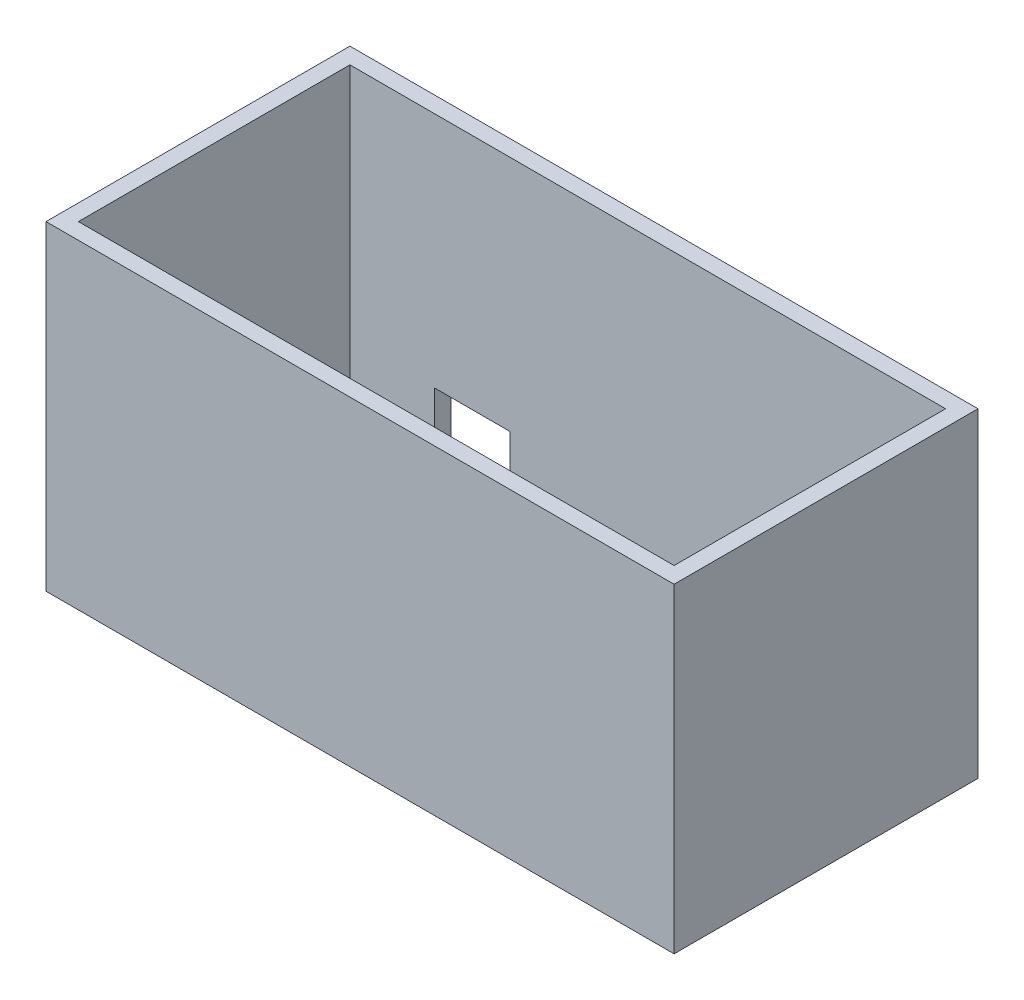
ISO-10303-21;
HEADER;
FILE_DESCRIPTION(('STEP AP214'),'2;1');
FILE_NAME('part.step','',(''),(''),'','','');
FILE_SCHEMA(('AUTOMOTIVE_DESIGN { 1 0 10303 214 1 1 1 1 }'));
ENDSEC;
DATA;
#1=APPLICATION_CONTEXT('core data for automotive mechanical design processes');
#2=APPLICATION_PROTOCOL_DEFINITION('international standard','automotive_design',2000,#1);
#3=PRODUCT_CONTEXT('',#1,'mechanical');
#4=PRODUCT('Part','Part','',(#3));
#5=PRODUCT_RELATED_PRODUCT_CATEGORY('part','',(#4));
#6=PRODUCT_DEFINITION_FORMATION('','',#4);
#7=PRODUCT_DEFINITION_CONTEXT('part definition',#1,'design');
#8=PRODUCT_DEFINITION('design','',#6,#7);
#9=PRODUCT_DEFINITION_SHAPE('','',#8);
#10=(LENGTH_UNIT() NAMED_UNIT(*) SI_UNIT(.MILLI.,.METRE.));
#11=(NAMED_UNIT(*) PLANE_ANGLE_UNIT() SI_UNIT($,.RADIAN.));
#12=(NAMED_UNIT(*) SI_UNIT($,.STERADIAN.) SOLID_ANGLE_UNIT());
#13=UNCERTAINTY_MEASURE_WITH_UNIT(LENGTH_MEASURE(1.E-05),#10,'distance_accuracy_value','');
#14=(GEOMETRIC_REPRESENTATION_CONTEXT(3) GLOBAL_UNCERTAINTY_ASSIGNED_CONTEXT((#13)) GLOBAL_UNIT_ASSIGNED_CONTEXT((#10,
#11,#12)) REPRESENTATION_CONTEXT('',''));
#15=CARTESIAN_POINT('',(0.,0.,0.));
#16=DIRECTION('',(0.,0.,1.));
#17=DIRECTION('',(1.,0.,0.));
#18=AXIS2_PLACEMENT_3D('',#15,#16,#17);
#19=CARTESIAN_POINT('',(98.425,5.08,47.625));
#20=DIRECTION('',(-1.,0.,0.));
#21=DIRECTION('',(0.,0.,1.));
#22=AXIS2_PLACEMENT_3D('',#19,#20,#21);
#23=PLANE('',#22);
#24=DIRECTION('',(0.,0.,-1.));
#25=VECTOR('',#24,1.);
#26=CARTESIAN_POINT('',(98.425,0.,47.625));
#27=LINE('',#26,#25);
#28=CARTESIAN_POINT('',(98.425,0.,47.625));
#29=VERTEX_POINT('',#28);
#30=CARTESIAN_POINT('',(98.425,0.,-47.625));
#31=VERTEX_POINT('',#30);
#32=EDGE_CURVE('E190',#29,#31,#27,.T.);
#33=ORIENTED_EDGE('',*,*,#32,.T.);
#34=DIRECTION('',(0.,-1.,0.));
#35=VECTOR('',#34,1.);
#36=CARTESIAN_POINT('',(98.425,5.08,-47.625));
#37=LINE('',#36,#35);
#38=CARTESIAN_POINT('',(98.425,100.33,-47.625));
#39=VERTEX_POINT('',#38);
#40=EDGE_CURVE('E208',#39,#31,#37,.T.);
#41=ORIENTED_EDGE('',*,*,#40,.F.);
#42=DIRECTION('',(0.,0.,-1.));
#43=VECTOR('',#42,1.);
#44=CARTESIAN_POINT('',(98.425,100.33,-47.625));
#45=LINE('',#44,#43);
#46=CARTESIAN_POINT('',(98.425,100.33,47.625));
#47=VERTEX_POINT('',#46);
#48=EDGE_CURVE('E187',#47,#39,#45,.T.);
#49=ORIENTED_EDGE('',*,*,#48,.F.);
#50=DIRECTION('',(0.,-1.,0.));
#51=VECTOR('',#50,1.);
#52=CARTESIAN_POINT('',(98.425,5.08,47.625));
#53=LINE('',#52,#51);
#54=EDGE_CURVE('E199',#47,#29,#53,.T.);
#55=ORIENTED_EDGE('',*,*,#54,.T.);
#56=EDGE_LOOP('',(#33,#41,#49,#55));
#57=FACE_BOUND('',#56,.T.);
#58=ADVANCED_FACE('F33',(#57),#23,.F.);
#59=CARTESIAN_POINT('',(-98.425,5.08,-47.625));
#60=DIRECTION('',(0.,0.,1.));
#61=DIRECTION('',(1.,0.,0.));
#62=AXIS2_PLACEMENT_3D('',#59,#60,#61);
#63=PLANE('',#62);
#64=DIRECTION('',(0.,1.,0.));
#65=VECTOR('',#64,1.);
#66=CARTESIAN_POINT('',(-66.7870745950812,5.65645799035935,-47.625));
#67=LINE('',#66,#65);
#68=CARTESIAN_POINT('',(-66.7870745950812,5.65645799035935,-47.625));
#69=VERTEX_POINT('',#68);
#70=CARTESIAN_POINT('',(-66.7870745950812,25.9005706396033,-47.625));
#71=VERTEX_POINT('',#70);
#72=EDGE_CURVE('E132',#69,#71,#67,.T.);
#73=ORIENTED_EDGE('',*,*,#72,.F.);
#74=DIRECTION('',(-1.,0.,0.));
#75=VECTOR('',#74,1.);
#76=CARTESIAN_POINT('',(-43.1453486340761,5.65645799035935,-47.625));
#77=LINE('',#76,#75);
#78=CARTESIAN_POINT('',(-43.1453486340761,5.65645799035935,-47.625));
#79=VERTEX_POINT('',#78);
#80=EDGE_CURVE('E47',#79,#69,#77,.T.);
#81=ORIENTED_EDGE('',*,*,#80,.F.);
#82=DIRECTION('',(0.,-1.,0.));
#83=VECTOR('',#82,1.);
#84=CARTESIAN_POINT('',(-43.1453486340761,25.9005706396033,-47.625));
#85=LINE('',#84,#83);
#86=CARTESIAN_POINT('',(-43.1453486340761,25.9005706396033,-47.625));
#87=VERTEX_POINT('',#86);
#88=EDGE_CURVE('E139',#87,#79,#85,.T.);
#89=ORIENTED_EDGE('',*,*,#88,.F.);
#90=DIRECTION('',(1.,0.,0.));
#91=VECTOR('',#90,1.);
#92=CARTESIAN_POINT('',(-66.7870745950812,25.9005706396033,-47.625));
#93=LINE('',#92,#91);
#94=EDGE_CURVE('E123',#71,#87,#93,.T.);
#95=ORIENTED_EDGE('',*,*,#94,.F.);
#96=EDGE_LOOP('',(#73,#81,#89,#95));
#97=FACE_BOUND('',#96,.T.);
#98=DIRECTION('',(-1.,0.,0.));
#99=VECTOR('',#98,1.);
#100=CARTESIAN_POINT('',(-98.425,0.,-47.625));
#101=LINE('',#100,#99);
#102=CARTESIAN_POINT('',(-98.425,0.,-47.625));
#103=VERTEX_POINT('',#102);
#104=EDGE_CURVE('E193',#31,#103,#101,.T.);
#105=ORIENTED_EDGE('',*,*,#104,.T.);
#106=DIRECTION('',(0.,-1.,0.));
#107=VECTOR('',#106,1.);
#108=CARTESIAN_POINT('',(-98.425,5.08,-47.625));
#109=LINE('',#108,#107);
#110=CARTESIAN_POINT('',(-98.425,100.33,-47.625));
#111=VERTEX_POINT('',#110);
#112=EDGE_CURVE('E205',#111,#103,#109,.T.);
#113=ORIENTED_EDGE('',*,*,#112,.F.);
#114=DIRECTION('',(-1.,0.,0.));
#115=VECTOR('',#114,1.);
#116=CARTESIAN_POINT('',(-98.425,100.33,-47.625));
#117=LINE('',#116,#115);
#118=EDGE_CURVE('E178',#39,#111,#117,.T.);
#119=ORIENTED_EDGE('',*,*,#118,.F.);
#120=ORIENTED_EDGE('',*,*,#40,.T.);
#121=EDGE_LOOP('',(#105,#113,#119,#120));
#122=FACE_BOUND('',#121,.T.);
#123=ADVANCED_FACE('F136',(#97,#122),#63,.F.);
#124=CARTESIAN_POINT('',(-98.425,5.08,47.625));
#125=DIRECTION('',(1.,0.,0.));
#126=DIRECTION('',(0.,0.,-1.));
#127=AXIS2_PLACEMENT_3D('',#124,#125,#126);
#128=PLANE('',#127);
#129=DIRECTION('',(0.,0.,1.));
#130=VECTOR('',#129,1.);
#131=CARTESIAN_POINT('',(-98.425,0.,47.625));
#132=LINE('',#131,#130);
#133=CARTESIAN_POINT('',(-98.425,0.,47.625));
#134=VERTEX_POINT('',#133);
#135=EDGE_CURVE('E195',#103,#134,#132,.T.);
#136=ORIENTED_EDGE('',*,*,#135,.T.);
#137=DIRECTION('',(0.,-1.,0.));
#138=VECTOR('',#137,1.);
#139=CARTESIAN_POINT('',(-98.425,5.08,47.625));
#140=LINE('',#139,#138);
#141=CARTESIAN_POINT('',(-98.425,100.33,47.625));
#142=VERTEX_POINT('',#141);
#143=EDGE_CURVE('E202',#142,#134,#140,.T.);
#144=ORIENTED_EDGE('',*,*,#143,.F.);
#145=DIRECTION('',(0.,0.,1.));
#146=VECTOR('',#145,1.);
#147=CARTESIAN_POINT('',(-98.425,100.33,47.625));
#148=LINE('',#147,#146);
#149=EDGE_CURVE('E181',#111,#142,#148,.T.);
#150=ORIENTED_EDGE('',*,*,#149,.F.);
#151=ORIENTED_EDGE('',*,*,#112,.T.);
#152=EDGE_LOOP('',(#136,#144,#150,#151));
#153=FACE_BOUND('',#152,.T.);
#154=ADVANCED_FACE('F239',(#153),#128,.F.);
#155=CARTESIAN_POINT('',(-98.425,5.08,47.625));
#156=DIRECTION('',(0.,0.,-1.));
#157=DIRECTION('',(-1.,0.,0.));
#158=AXIS2_PLACEMENT_3D('',#155,#156,#157);
#159=PLANE('',#158);
#160=DIRECTION('',(1.,0.,0.));
#161=VECTOR('',#160,1.);
#162=CARTESIAN_POINT('',(-98.425,0.,47.625));
#163=LINE('',#162,#161);
#164=EDGE_CURVE('E197',#134,#29,#163,.T.);
#165=ORIENTED_EDGE('',*,*,#164,.T.);
#166=ORIENTED_EDGE('',*,*,#54,.F.);
#167=DIRECTION('',(1.,0.,0.));
#168=VECTOR('',#167,1.);
#169=CARTESIAN_POINT('',(98.425,100.33,47.625));
#170=LINE('',#169,#168);
#171=EDGE_CURVE('E184',#142,#47,#170,.T.);
#172=ORIENTED_EDGE('',*,*,#171,.F.);
#173=ORIENTED_EDGE('',*,*,#143,.T.);
#174=EDGE_LOOP('',(#165,#166,#172,#173));
#175=FACE_BOUND('',#174,.T.);
#176=ADVANCED_FACE('F253',(#175),#159,.F.);
#177=CARTESIAN_POINT('',(0.,0.,0.));
#178=DIRECTION('',(0.,-1.,0.));
#179=DIRECTION('',(0.,0.,-1.));
#180=AXIS2_PLACEMENT_3D('',#177,#178,#179);
#181=PLANE('',#180);
#182=ORIENTED_EDGE('',*,*,#32,.F.);
#183=ORIENTED_EDGE('',*,*,#164,.F.);
#184=ORIENTED_EDGE('',*,*,#135,.F.);
#185=ORIENTED_EDGE('',*,*,#104,.F.);
#186=EDGE_LOOP('',(#182,#183,#184,#185));
#187=FACE_BOUND('',#186,.T.);
#188=ADVANCED_FACE('F244',(#187),#181,.T.);
#189=CARTESIAN_POINT('',(0.,100.33,0.));
#190=DIRECTION('',(0.,-1.,0.));
#191=DIRECTION('',(0.,0.,-1.));
#192=AXIS2_PLACEMENT_3D('',#189,#190,#191);
#193=PLANE('',#192);
#194=ORIENTED_EDGE('',*,*,#118,.T.);
#195=ORIENTED_EDGE('',*,*,#149,.T.);
#196=ORIENTED_EDGE('',*,*,#171,.T.);
#197=ORIENTED_EDGE('',*,*,#48,.T.);
#198=EDGE_LOOP('',(#194,#195,#196,#197));
#199=FACE_BOUND('',#198,.T.);
#200=DIRECTION('',(0.,0.,1.));
#201=VECTOR('',#200,1.);
#202=CARTESIAN_POINT('',(-93.345,100.33,42.545));
#203=LINE('',#202,#201);
#204=CARTESIAN_POINT('',(-93.345,100.33,-42.545));
#205=VERTEX_POINT('',#204);
#206=CARTESIAN_POINT('',(-93.345,100.33,42.545));
#207=VERTEX_POINT('',#206);
#208=EDGE_CURVE('E149',#205,#207,#203,.T.);
#209=ORIENTED_EDGE('',*,*,#208,.F.);
#210=DIRECTION('',(-1.,0.,0.));
#211=VECTOR('',#210,1.);
#212=CARTESIAN_POINT('',(-93.345,100.33,-42.545));
#213=LINE('',#212,#211);
#214=CARTESIAN_POINT('',(93.345,100.33,-42.545));
#215=VERTEX_POINT('',#214);
#216=EDGE_CURVE('E157',#215,#205,#213,.T.);
#217=ORIENTED_EDGE('',*,*,#216,.F.);
#218=DIRECTION('',(0.,0.,-1.));
#219=VECTOR('',#218,1.);
#220=CARTESIAN_POINT('',(93.345,100.33,-42.545));
#221=LINE('',#220,#219);
#222=CARTESIAN_POINT('',(93.345,100.33,42.545));
#223=VERTEX_POINT('',#222);
#224=EDGE_CURVE('E154',#223,#215,#221,.T.);
#225=ORIENTED_EDGE('',*,*,#224,.F.);
#226=DIRECTION('',(1.,0.,0.));
#227=VECTOR('',#226,1.);
#228=CARTESIAN_POINT('',(93.345,100.33,42.545));
#229=LINE('',#228,#227);
#230=EDGE_CURVE('E151',#207,#223,#229,.T.);
#231=ORIENTED_EDGE('',*,*,#230,.F.);
#232=EDGE_LOOP('',(#209,#217,#225,#231));
#233=FACE_BOUND('',#232,.T.);
#234=ADVANCED_FACE('F249',(#199,#233),#193,.F.);
#235=CARTESIAN_POINT('',(-93.345,100.33,42.545));
#236=DIRECTION('',(1.,0.,0.));
#237=DIRECTION('',(0.,0.,-1.));
#238=AXIS2_PLACEMENT_3D('',#235,#236,#237);
#239=PLANE('',#238);
#240=DIRECTION('',(0.,0.,1.));
#241=VECTOR('',#240,1.);
#242=CARTESIAN_POINT('',(-93.345,5.08,42.545));
#243=LINE('',#242,#241);
#244=CARTESIAN_POINT('',(-93.345,5.08,-42.545));
#245=VERTEX_POINT('',#244);
#246=CARTESIAN_POINT('',(-93.345,5.08,42.545));
#247=VERTEX_POINT('',#246);
#248=EDGE_CURVE('E146',#245,#247,#243,.T.);
#249=ORIENTED_EDGE('',*,*,#248,.F.);
#250=DIRECTION('',(0.,-1.,0.));
#251=VECTOR('',#250,1.);
#252=CARTESIAN_POINT('',(-93.345,100.33,-42.545));
#253=LINE('',#252,#251);
#254=EDGE_CURVE('E159',#205,#245,#253,.T.);
#255=ORIENTED_EDGE('',*,*,#254,.F.);
#256=ORIENTED_EDGE('',*,*,#208,.T.);
#257=DIRECTION('',(0.,-1.,0.));
#258=VECTOR('',#257,1.);
#259=CARTESIAN_POINT('',(-93.345,100.33,42.545));
#260=LINE('',#259,#258);
#261=EDGE_CURVE('E175',#207,#247,#260,.T.);
#262=ORIENTED_EDGE('',*,*,#261,.T.);
#263=EDGE_LOOP('',(#249,#255,#256,#262));
#264=FACE_BOUND('',#263,.T.);
#265=ADVANCED_FACE('F266',(#264),#239,.T.);
#266=CARTESIAN_POINT('',(93.345,100.33,42.545));
#267=DIRECTION('',(0.,0.,-1.));
#268=DIRECTION('',(-1.,0.,0.));
#269=AXIS2_PLACEMENT_3D('',#266,#267,#268);
#270=PLANE('',#269);
#271=DIRECTION('',(1.,0.,0.));
#272=VECTOR('',#271,1.);
#273=CARTESIAN_POINT('',(93.345,5.08,42.545));
#274=LINE('',#273,#272);
#275=CARTESIAN_POINT('',(93.345,5.08,42.545));
#276=VERTEX_POINT('',#275);
#277=EDGE_CURVE('E162',#247,#276,#274,.T.);
#278=ORIENTED_EDGE('',*,*,#277,.F.);
#279=ORIENTED_EDGE('',*,*,#261,.F.);
#280=ORIENTED_EDGE('',*,*,#230,.T.);
#281=DIRECTION('',(0.,-1.,0.));
#282=VECTOR('',#281,1.);
#283=CARTESIAN_POINT('',(93.345,100.33,42.545));
#284=LINE('',#283,#282);
#285=EDGE_CURVE('E173',#223,#276,#284,.T.);
#286=ORIENTED_EDGE('',*,*,#285,.T.);
#287=EDGE_LOOP('',(#278,#279,#280,#286));
#288=FACE_BOUND('',#287,.T.);
#289=ADVANCED_FACE('F269',(#288),#270,.T.);
#290=CARTESIAN_POINT('',(93.345,100.33,-42.545));
#291=DIRECTION('',(-1.,0.,0.));
#292=DIRECTION('',(0.,0.,1.));
#293=AXIS2_PLACEMENT_3D('',#290,#291,#292);
#294=PLANE('',#293);
#295=DIRECTION('',(0.,0.,-1.));
#296=VECTOR('',#295,1.);
#297=CARTESIAN_POINT('',(93.345,5.08,-42.545));
#298=LINE('',#297,#296);
#299=CARTESIAN_POINT('',(93.345,5.08,-42.545));
#300=VERTEX_POINT('',#299);
#301=EDGE_CURVE('E165',#276,#300,#298,.T.);
#302=ORIENTED_EDGE('',*,*,#301,.F.);
#303=ORIENTED_EDGE('',*,*,#285,.F.);
#304=ORIENTED_EDGE('',*,*,#224,.T.);
#305=DIRECTION('',(0.,-1.,0.));
#306=VECTOR('',#305,1.);
#307=CARTESIAN_POINT('',(93.345,100.33,-42.545));
#308=LINE('',#307,#306);
#309=EDGE_CURVE('E171',#215,#300,#308,.T.);
#310=ORIENTED_EDGE('',*,*,#309,.T.);
#311=EDGE_LOOP('',(#302,#303,#304,#310));
#312=FACE_BOUND('',#311,.T.);
#313=ADVANCED_FACE('F273',(#312),#294,.T.);
#314=CARTESIAN_POINT('',(-93.345,100.33,-42.545));
#315=DIRECTION('',(0.,0.,1.));
#316=DIRECTION('',(1.,0.,0.));
#317=AXIS2_PLACEMENT_3D('',#314,#315,#316);
#318=PLANE('',#317);
#319=DIRECTION('',(1.,0.,0.));
#320=VECTOR('',#319,1.);
#321=CARTESIAN_POINT('',(-93.345,5.65645799035935,-42.545));
#322=LINE('',#321,#320);
#323=CARTESIAN_POINT('',(-66.7870745950812,5.65645799035935,-42.545));
#324=VERTEX_POINT('',#323);
#325=CARTESIAN_POINT('',(-43.1453486340761,5.65645799035935,-42.545));
#326=VERTEX_POINT('',#325);
#327=EDGE_CURVE('E11',#324,#326,#322,.T.);
#328=ORIENTED_EDGE('',*,*,#327,.F.);
#329=DIRECTION('',(0.,-1.,0.));
#330=VECTOR('',#329,1.);
#331=CARTESIAN_POINT('',(-66.7870745950812,100.33,-42.545));
#332=LINE('',#331,#330);
#333=CARTESIAN_POINT('',(-66.7870745950812,25.9005706396033,-42.545));
#334=VERTEX_POINT('',#333);
#335=EDGE_CURVE('E211',#334,#324,#332,.T.);
#336=ORIENTED_EDGE('',*,*,#335,.F.);
#337=DIRECTION('',(-1.,0.,0.));
#338=VECTOR('',#337,1.);
#339=CARTESIAN_POINT('',(-93.345,25.9005706396033,-42.545));
#340=LINE('',#339,#338);
#341=CARTESIAN_POINT('',(-43.1453486340761,25.9005706396033,-42.545));
#342=VERTEX_POINT('',#341);
#343=EDGE_CURVE('E126',#342,#334,#340,.T.);
#344=ORIENTED_EDGE('',*,*,#343,.F.);
#345=DIRECTION('',(0.,1.,0.));
#346=VECTOR('',#345,1.);
#347=CARTESIAN_POINT('',(-43.1453486340761,100.33,-42.545));
#348=LINE('',#347,#346);
#349=EDGE_CURVE('E40',#326,#342,#348,.T.);
#350=ORIENTED_EDGE('',*,*,#349,.F.);
#351=EDGE_LOOP('',(#328,#336,#344,#350));
#352=FACE_BOUND('',#351,.T.);
#353=DIRECTION('',(-1.,0.,0.));
#354=VECTOR('',#353,1.);
#355=CARTESIAN_POINT('',(-93.345,5.08,-42.545));
#356=LINE('',#355,#354);
#357=EDGE_CURVE('E152',#300,#245,#356,.T.);
#358=ORIENTED_EDGE('',*,*,#357,.F.);
#359=ORIENTED_EDGE('',*,*,#309,.F.);
#360=ORIENTED_EDGE('',*,*,#216,.T.);
#361=ORIENTED_EDGE('',*,*,#254,.T.);
#362=EDGE_LOOP('',(#358,#359,#360,#361));
#363=FACE_BOUND('',#362,.T.);
#364=ADVANCED_FACE('F219',(#352,#363),#318,.T.);
#365=CARTESIAN_POINT('',(0.,5.08,0.));
#366=DIRECTION('',(0.,-1.,0.));
#367=DIRECTION('',(0.,0.,-1.));
#368=AXIS2_PLACEMENT_3D('',#365,#366,#367);
#369=PLANE('',#368);
#370=ORIENTED_EDGE('',*,*,#357,.T.);
#371=ORIENTED_EDGE('',*,*,#248,.T.);
#372=ORIENTED_EDGE('',*,*,#277,.T.);
#373=ORIENTED_EDGE('',*,*,#301,.T.);
#374=EDGE_LOOP('',(#370,#371,#372,#373));
#375=FACE_BOUND('',#374,.T.);
#376=ADVANCED_FACE('F223',(#375),#369,.F.);
#377=CARTESIAN_POINT('',(-43.1453486340761,5.65645799035935,-40.005));
#378=DIRECTION('',(0.,-1.,0.));
#379=DIRECTION('',(0.,0.,-1.));
#380=AXIS2_PLACEMENT_3D('',#377,#378,#379);
#381=PLANE('',#380);
#382=ORIENTED_EDGE('',*,*,#327,.T.);
#383=DIRECTION('',(0.,0.,-1.));
#384=VECTOR('',#383,1.);
#385=CARTESIAN_POINT('',(-43.1453486340761,5.65645799035935,-40.005));
#386=LINE('',#385,#384);
#387=EDGE_CURVE('E144',#326,#79,#386,.T.);
#388=ORIENTED_EDGE('',*,*,#387,.T.);
#389=ORIENTED_EDGE('',*,*,#80,.T.);
#390=DIRECTION('',(0.,0.,-1.));
#391=VECTOR('',#390,1.);
#392=CARTESIAN_POINT('',(-66.7870745950812,5.65645799035935,-40.005));
#393=LINE('',#392,#391);
#394=EDGE_CURVE('E129',#324,#69,#393,.T.);
#395=ORIENTED_EDGE('',*,*,#394,.F.);
#396=EDGE_LOOP('',(#382,#388,#389,#395));
#397=FACE_BOUND('',#396,.T.);
#398=ADVANCED_FACE('F221',(#397),#381,.F.);
#399=CARTESIAN_POINT('',(-43.1453486340761,25.9005706396033,-40.005));
#400=DIRECTION('',(1.,0.,0.));
#401=DIRECTION('',(0.,0.,-1.));
#402=AXIS2_PLACEMENT_3D('',#399,#400,#401);
#403=PLANE('',#402);
#404=ORIENTED_EDGE('',*,*,#349,.T.);
#405=DIRECTION('',(0.,0.,-1.));
#406=VECTOR('',#405,1.);
#407=CARTESIAN_POINT('',(-43.1453486340761,25.9005706396033,-40.005));
#408=LINE('',#407,#406);
#409=EDGE_CURVE('E128',#342,#87,#408,.T.);
#410=ORIENTED_EDGE('',*,*,#409,.T.);
#411=ORIENTED_EDGE('',*,*,#88,.T.);
#412=ORIENTED_EDGE('',*,*,#387,.F.);
#413=EDGE_LOOP('',(#404,#410,#411,#412));
#414=FACE_BOUND('',#413,.T.);
#415=ADVANCED_FACE('F216',(#414),#403,.F.);
#416=CARTESIAN_POINT('',(-66.7870745950812,25.9005706396033,-40.005));
#417=DIRECTION('',(0.,1.,0.));
#418=DIRECTION('',(-1.,0.,0.));
#419=AXIS2_PLACEMENT_3D('',#416,#417,#418);
#420=PLANE('',#419);
#421=ORIENTED_EDGE('',*,*,#343,.T.);
#422=DIRECTION('',(0.,0.,-1.));
#423=VECTOR('',#422,1.);
#424=CARTESIAN_POINT('',(-66.7870745950812,25.9005706396033,-40.005));
#425=LINE('',#424,#423);
#426=EDGE_CURVE('E55',#334,#71,#425,.T.);
#427=ORIENTED_EDGE('',*,*,#426,.T.);
#428=ORIENTED_EDGE('',*,*,#94,.T.);
#429=ORIENTED_EDGE('',*,*,#409,.F.);
#430=EDGE_LOOP('',(#421,#427,#428,#429));
#431=FACE_BOUND('',#430,.T.);
#432=ADVANCED_FACE('F120',(#431),#420,.F.);
#433=CARTESIAN_POINT('',(-66.7870745950812,5.65645799035935,-40.005));
#434=DIRECTION('',(-1.,0.,0.));
#435=DIRECTION('',(0.,0.,1.));
#436=AXIS2_PLACEMENT_3D('',#433,#434,#435);
#437=PLANE('',#436);
#438=ORIENTED_EDGE('',*,*,#335,.T.);
#439=ORIENTED_EDGE('',*,*,#394,.T.);
#440=ORIENTED_EDGE('',*,*,#72,.T.);
#441=ORIENTED_EDGE('',*,*,#426,.F.);
#442=EDGE_LOOP('',(#438,#439,#440,#441));
#443=FACE_BOUND('',#442,.T.);
#444=ADVANCED_FACE('F133',(#443),#437,.F.);
#445=CLOSED_SHELL('',(#58,#123,#154,#176,#188,#234,#265,#289,#313,#364,#376,#398,#415,#432,#444));
#446=MANIFOLD_SOLID_BREP('B2',#445);
#447=ADVANCED_BREP_SHAPE_REPRESENTATION('',(#18,#446),#14);
#448=SHAPE_DEFINITION_REPRESENTATION(#9,#447);
ENDSEC;
END-ISO-10303-21;
